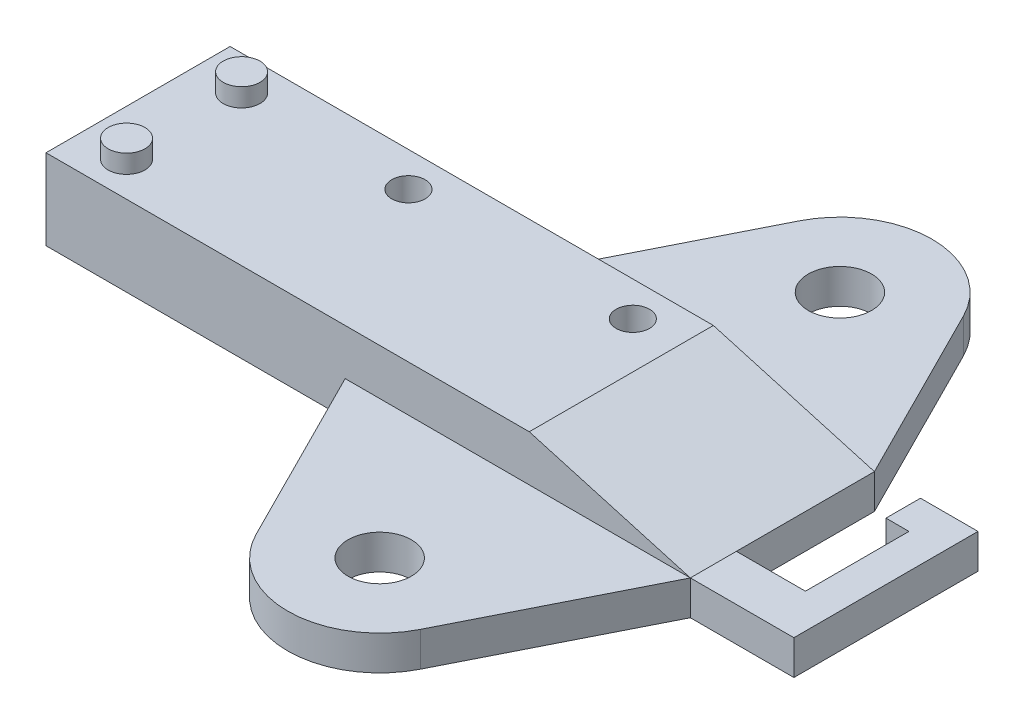
ISO-10303-21;
HEADER;
FILE_DESCRIPTION(('STEP AP214'),'2;1');
FILE_NAME('part.step','',(''),(''),'','','');
FILE_SCHEMA(('AUTOMOTIVE_DESIGN { 1 0 10303 214 1 1 1 1 }'));
ENDSEC;
DATA;
#1=APPLICATION_CONTEXT('core data for automotive mechanical design processes');
#2=APPLICATION_PROTOCOL_DEFINITION('international standard','automotive_design',2000,#1);
#3=PRODUCT_CONTEXT('',#1,'mechanical');
#4=PRODUCT('Part','Part','',(#3));
#5=PRODUCT_RELATED_PRODUCT_CATEGORY('part','',(#4));
#6=PRODUCT_DEFINITION_FORMATION('','',#4);
#7=PRODUCT_DEFINITION_CONTEXT('part definition',#1,'design');
#8=PRODUCT_DEFINITION('design','',#6,#7);
#9=PRODUCT_DEFINITION_SHAPE('','',#8);
#10=(LENGTH_UNIT() NAMED_UNIT(*) SI_UNIT(.MILLI.,.METRE.));
#11=(NAMED_UNIT(*) PLANE_ANGLE_UNIT() SI_UNIT($,.RADIAN.));
#12=(NAMED_UNIT(*) SI_UNIT($,.STERADIAN.) SOLID_ANGLE_UNIT());
#13=UNCERTAINTY_MEASURE_WITH_UNIT(LENGTH_MEASURE(1.E-05),#10,'distance_accuracy_value','');
#14=(GEOMETRIC_REPRESENTATION_CONTEXT(3) GLOBAL_UNCERTAINTY_ASSIGNED_CONTEXT((#13)) GLOBAL_UNIT_ASSIGNED_CONTEXT((#10,
#11,#12)) REPRESENTATION_CONTEXT('',''));
#15=CARTESIAN_POINT('',(0.,0.,0.));
#16=DIRECTION('',(0.,0.,1.));
#17=DIRECTION('',(1.,0.,0.));
#18=AXIS2_PLACEMENT_3D('',#15,#16,#17);
#19=CARTESIAN_POINT('',(-21.,7.,8.));
#20=DIRECTION('',(0.,0.,-1.));
#21=DIRECTION('',(-1.,0.,0.));
#22=AXIS2_PLACEMENT_3D('',#19,#20,#21);
#23=PLANE('',#22);
#24=DIRECTION('',(0.,-1.,0.));
#25=VECTOR('',#24,1.);
#26=CARTESIAN_POINT('',(5.00000000000001,3.,8.));
#27=LINE('',#26,#25);
#28=CARTESIAN_POINT('',(5.00000000000001,3.,8.));
#29=VERTEX_POINT('',#28);
#30=CARTESIAN_POINT('',(5.,0.,8.));
#31=VERTEX_POINT('',#30);
#32=EDGE_CURVE('E191',#29,#31,#27,.T.);
#33=ORIENTED_EDGE('',*,*,#32,.F.);
#34=DIRECTION('',(-1.,0.,0.));
#35=VECTOR('',#34,1.);
#36=CARTESIAN_POINT('',(5.00000000000001,3.,8.));
#37=LINE('',#36,#35);
#38=CARTESIAN_POINT('',(35.,3.,8.));
#39=VERTEX_POINT('',#38);
#40=EDGE_CURVE('E11',#39,#29,#37,.T.);
#41=ORIENTED_EDGE('',*,*,#40,.F.);
#42=DIRECTION('',(-0.961523947640823,0.274721127897378,0.));
#43=VECTOR('',#42,1.);
#44=CARTESIAN_POINT('',(21.,7.,8.));
#45=LINE('',#44,#43);
#46=CARTESIAN_POINT('',(21.,7.,8.));
#47=VERTEX_POINT('',#46);
#48=EDGE_CURVE('E189',#39,#47,#45,.T.);
#49=ORIENTED_EDGE('',*,*,#48,.T.);
#50=DIRECTION('',(1.,0.,0.));
#51=VECTOR('',#50,1.);
#52=CARTESIAN_POINT('',(-21.,7.,8.));
#53=LINE('',#52,#51);
#54=CARTESIAN_POINT('',(-21.,7.,8.));
#55=VERTEX_POINT('',#54);
#56=EDGE_CURVE('E328',#55,#47,#53,.T.);
#57=ORIENTED_EDGE('',*,*,#56,.F.);
#58=DIRECTION('',(0.,-1.,0.));
#59=VECTOR('',#58,1.);
#60=CARTESIAN_POINT('',(-21.,7.,8.));
#61=LINE('',#60,#59);
#62=CARTESIAN_POINT('',(-21.,0.,8.));
#63=VERTEX_POINT('',#62);
#64=EDGE_CURVE('E327',#55,#63,#61,.T.);
#65=ORIENTED_EDGE('',*,*,#64,.T.);
#66=DIRECTION('',(1.,0.,0.));
#67=VECTOR('',#66,1.);
#68=CARTESIAN_POINT('',(-21.,0.,8.));
#69=LINE('',#68,#67);
#70=EDGE_CURVE('E58',#63,#31,#69,.T.);
#71=ORIENTED_EDGE('',*,*,#70,.T.);
#72=EDGE_LOOP('',(#33,#41,#49,#57,#65,#71));
#73=FACE_BOUND('',#72,.T.);
#74=ADVANCED_FACE('F33',(#73),#23,.F.);
#75=CARTESIAN_POINT('',(-21.,7.,-8.));
#76=DIRECTION('',(0.,0.,1.));
#77=DIRECTION('',(1.,0.,0.));
#78=AXIS2_PLACEMENT_3D('',#75,#76,#77);
#79=PLANE('',#78);
#80=DIRECTION('',(1.,0.,0.));
#81=VECTOR('',#80,1.);
#82=CARTESIAN_POINT('',(5.00000000000001,3.,-8.));
#83=LINE('',#82,#81);
#84=CARTESIAN_POINT('',(5.00000000000001,3.,-8.));
#85=VERTEX_POINT('',#84);
#86=CARTESIAN_POINT('',(35.,3.,-8.));
#87=VERTEX_POINT('',#86);
#88=EDGE_CURVE('E362',#85,#87,#83,.T.);
#89=ORIENTED_EDGE('',*,*,#88,.F.);
#90=DIRECTION('',(0.,-1.,0.));
#91=VECTOR('',#90,1.);
#92=CARTESIAN_POINT('',(5.00000000000001,3.,-8.));
#93=LINE('',#92,#91);
#94=CARTESIAN_POINT('',(5.,0.,-8.));
#95=VERTEX_POINT('',#94);
#96=EDGE_CURVE('E297',#85,#95,#93,.T.);
#97=ORIENTED_EDGE('',*,*,#96,.T.);
#98=DIRECTION('',(-1.,0.,0.));
#99=VECTOR('',#98,1.);
#100=CARTESIAN_POINT('',(-21.,0.,-8.));
#101=LINE('',#100,#99);
#102=CARTESIAN_POINT('',(-21.,0.,-8.));
#103=VERTEX_POINT('',#102);
#104=EDGE_CURVE('E311',#95,#103,#101,.T.);
#105=ORIENTED_EDGE('',*,*,#104,.T.);
#106=DIRECTION('',(0.,-1.,0.));
#107=VECTOR('',#106,1.);
#108=CARTESIAN_POINT('',(-21.,7.,-8.));
#109=LINE('',#108,#107);
#110=CARTESIAN_POINT('',(-21.,7.,-8.));
#111=VERTEX_POINT('',#110);
#112=EDGE_CURVE('E42',#111,#103,#109,.T.);
#113=ORIENTED_EDGE('',*,*,#112,.F.);
#114=DIRECTION('',(-1.,0.,0.));
#115=VECTOR('',#114,1.);
#116=CARTESIAN_POINT('',(-21.,7.,-8.));
#117=LINE('',#116,#115);
#118=CARTESIAN_POINT('',(21.,7.,-8.));
#119=VERTEX_POINT('',#118);
#120=EDGE_CURVE('E354',#119,#111,#117,.T.);
#121=ORIENTED_EDGE('',*,*,#120,.F.);
#122=DIRECTION('',(-0.961523947640823,0.274721127897378,0.));
#123=VECTOR('',#122,1.);
#124=CARTESIAN_POINT('',(21.,7.,-8.));
#125=LINE('',#124,#123);
#126=EDGE_CURVE('E213',#87,#119,#125,.T.);
#127=ORIENTED_EDGE('',*,*,#126,.F.);
#128=EDGE_LOOP('',(#89,#97,#105,#113,#121,#127));
#129=FACE_BOUND('',#128,.T.);
#130=ADVANCED_FACE('F35',(#129),#79,.F.);
#131=CARTESIAN_POINT('',(-21.,7.,-8.));
#132=DIRECTION('',(1.,0.,0.));
#133=DIRECTION('',(0.,0.,-1.));
#134=AXIS2_PLACEMENT_3D('',#131,#132,#133);
#135=PLANE('',#134);
#136=DIRECTION('',(0.,0.,1.));
#137=VECTOR('',#136,1.);
#138=CARTESIAN_POINT('',(-21.,0.,-8.));
#139=LINE('',#138,#137);
#140=EDGE_CURVE('E321',#103,#63,#139,.T.);
#141=ORIENTED_EDGE('',*,*,#140,.T.);
#142=ORIENTED_EDGE('',*,*,#64,.F.);
#143=DIRECTION('',(0.,0.,1.));
#144=VECTOR('',#143,1.);
#145=CARTESIAN_POINT('',(-21.,7.,-8.));
#146=LINE('',#145,#144);
#147=EDGE_CURVE('E336',#111,#55,#146,.T.);
#148=ORIENTED_EDGE('',*,*,#147,.F.);
#149=ORIENTED_EDGE('',*,*,#112,.T.);
#150=EDGE_LOOP('',(#141,#142,#148,#149));
#151=FACE_BOUND('',#150,.T.);
#152=ADVANCED_FACE('F334',(#151),#135,.F.);
#153=CARTESIAN_POINT('',(0.,7.,0.));
#154=DIRECTION('',(0.,1.,0.));
#155=DIRECTION('',(0.,0.,1.));
#156=AXIS2_PLACEMENT_3D('',#153,#154,#155);
#157=PLANE('',#156);
#158=CARTESIAN_POINT('',(17.,7.,-5.));
#159=DIRECTION('',(0.,1.,0.));
#160=DIRECTION('',(0.,0.,1.));
#161=AXIS2_PLACEMENT_3D('',#158,#159,#160);
#162=CIRCLE('',#161,1.45);
#163=CARTESIAN_POINT('',(17.,7.,-3.55));
#164=VERTEX_POINT('',#163);
#165=EDGE_CURVE('E715',#164,#164,#162,.T.);
#166=ORIENTED_EDGE('',*,*,#165,.F.);
#167=EDGE_LOOP('',(#166));
#168=FACE_BOUND('',#167,.T.);
#169=CARTESIAN_POINT('',(-2.5,7.,-5.));
#170=DIRECTION('',(0.,1.,0.));
#171=DIRECTION('',(0.,0.,1.));
#172=AXIS2_PLACEMENT_3D('',#169,#170,#171);
#173=CIRCLE('',#172,1.45);
#174=CARTESIAN_POINT('',(-2.5,7.,-3.55));
#175=VERTEX_POINT('',#174);
#176=EDGE_CURVE('E723',#175,#175,#173,.T.);
#177=ORIENTED_EDGE('',*,*,#176,.F.);
#178=EDGE_LOOP('',(#177));
#179=FACE_BOUND('',#178,.T.);
#180=CARTESIAN_POINT('',(-17.,7.,5.));
#181=DIRECTION('',(0.,1.,0.));
#182=DIRECTION('',(0.,0.,1.));
#183=AXIS2_PLACEMENT_3D('',#180,#181,#182);
#184=CIRCLE('',#183,1.6);
#185=CARTESIAN_POINT('',(-17.,7.,6.6));
#186=VERTEX_POINT('',#185);
#187=EDGE_CURVE('E350',#186,#186,#184,.T.);
#188=ORIENTED_EDGE('',*,*,#187,.F.);
#189=EDGE_LOOP('',(#188));
#190=FACE_BOUND('',#189,.T.);
#191=CARTESIAN_POINT('',(-17.,7.,-5.));
#192=DIRECTION('',(0.,1.,0.));
#193=DIRECTION('',(0.,0.,1.));
#194=AXIS2_PLACEMENT_3D('',#191,#192,#193);
#195=CIRCLE('',#194,1.6);
#196=CARTESIAN_POINT('',(-17.,7.,-3.4));
#197=VERTEX_POINT('',#196);
#198=EDGE_CURVE('E342',#197,#197,#195,.T.);
#199=ORIENTED_EDGE('',*,*,#198,.F.);
#200=EDGE_LOOP('',(#199));
#201=FACE_BOUND('',#200,.T.);
#202=DIRECTION('',(0.,0.,-1.));
#203=VECTOR('',#202,1.);
#204=CARTESIAN_POINT('',(21.,7.,-8.));
#205=LINE('',#204,#203);
#206=EDGE_CURVE('E212',#47,#119,#205,.T.);
#207=ORIENTED_EDGE('',*,*,#206,.T.);
#208=ORIENTED_EDGE('',*,*,#120,.T.);
#209=ORIENTED_EDGE('',*,*,#147,.T.);
#210=ORIENTED_EDGE('',*,*,#56,.T.);
#211=EDGE_LOOP('',(#207,#208,#209,#210));
#212=FACE_BOUND('',#211,.T.);
#213=ADVANCED_FACE('F359',(#168,#179,#190,#201,#212),#157,.T.);
#214=CARTESIAN_POINT('',(0.,0.,0.));
#215=DIRECTION('',(0.,1.,0.));
#216=DIRECTION('',(0.,0.,1.));
#217=AXIS2_PLACEMENT_3D('',#214,#215,#216);
#218=PLANE('',#217);
#219=DIRECTION('',(-0.449766227502967,0.,-0.893146315335707));
#220=VECTOR('',#219,1.);
#221=CARTESIAN_POINT('',(35.,0.,-8.));
#222=LINE('',#221,#220);
#223=CARTESIAN_POINT('',(35.,0.,-8.));
#224=VERTEX_POINT('',#223);
#225=CARTESIAN_POINT('',(27.1451705226857,0.,-23.5981298200237));
#226=VERTEX_POINT('',#225);
#227=EDGE_CURVE('E283',#224,#226,#222,.T.);
#228=ORIENTED_EDGE('',*,*,#227,.F.);
#229=DIRECTION('',(0.,0.,-1.));
#230=VECTOR('',#229,1.);
#231=CARTESIAN_POINT('',(35.,0.,8.));
#232=LINE('',#231,#230);
#233=CARTESIAN_POINT('',(35.,0.,4.));
#234=VERTEX_POINT('',#233);
#235=EDGE_CURVE('E183',#234,#224,#232,.T.);
#236=ORIENTED_EDGE('',*,*,#235,.F.);
#237=DIRECTION('',(-1.,0.,0.));
#238=VECTOR('',#237,1.);
#239=CARTESIAN_POINT('',(41.,0.,4.));
#240=LINE('',#239,#238);
#241=CARTESIAN_POINT('',(41.,0.,4.));
#242=VERTEX_POINT('',#241);
#243=EDGE_CURVE('E50',#242,#234,#240,.T.);
#244=ORIENTED_EDGE('',*,*,#243,.F.);
#245=DIRECTION('',(0.,0.,1.));
#246=VECTOR('',#245,1.);
#247=CARTESIAN_POINT('',(41.,0.,-5.));
#248=LINE('',#247,#246);
#249=CARTESIAN_POINT('',(41.,0.,-5.));
#250=VERTEX_POINT('',#249);
#251=EDGE_CURVE('E237',#250,#242,#248,.T.);
#252=ORIENTED_EDGE('',*,*,#251,.F.);
#253=DIRECTION('',(1.,0.,0.));
#254=VECTOR('',#253,1.);
#255=CARTESIAN_POINT('',(39.,0.,-5.));
#256=LINE('',#255,#254);
#257=CARTESIAN_POINT('',(39.,0.,-5.));
#258=VERTEX_POINT('',#257);
#259=EDGE_CURVE('E271',#258,#250,#256,.T.);
#260=ORIENTED_EDGE('',*,*,#259,.F.);
#261=DIRECTION('',(0.,0.,1.));
#262=VECTOR('',#261,1.);
#263=CARTESIAN_POINT('',(39.,0.,-8.));
#264=LINE('',#263,#262);
#265=CARTESIAN_POINT('',(39.,0.,-8.));
#266=VERTEX_POINT('',#265);
#267=EDGE_CURVE('E266',#266,#258,#264,.T.);
#268=ORIENTED_EDGE('',*,*,#267,.F.);
#269=DIRECTION('',(-1.,0.,0.));
#270=VECTOR('',#269,1.);
#271=CARTESIAN_POINT('',(44.,0.,-8.));
#272=LINE('',#271,#270);
#273=CARTESIAN_POINT('',(44.,0.,-8.));
#274=VERTEX_POINT('',#273);
#275=EDGE_CURVE('E264',#274,#266,#272,.T.);
#276=ORIENTED_EDGE('',*,*,#275,.F.);
#277=DIRECTION('',(0.,0.,-1.));
#278=VECTOR('',#277,1.);
#279=CARTESIAN_POINT('',(44.,0.,8.));
#280=LINE('',#279,#278);
#281=CARTESIAN_POINT('',(44.,0.,8.));
#282=VERTEX_POINT('',#281);
#283=EDGE_CURVE('E257',#282,#274,#280,.T.);
#284=ORIENTED_EDGE('',*,*,#283,.F.);
#285=DIRECTION('',(1.,0.,0.));
#286=VECTOR('',#285,1.);
#287=CARTESIAN_POINT('',(35.,0.,8.));
#288=LINE('',#287,#286);
#289=CARTESIAN_POINT('',(35.,0.,8.));
#290=VERTEX_POINT('',#289);
#291=EDGE_CURVE('E262',#290,#282,#288,.T.);
#292=ORIENTED_EDGE('',*,*,#291,.F.);
#293=DIRECTION('',(0.449766227502967,0.,-0.893146315335707));
#294=VECTOR('',#293,1.);
#295=CARTESIAN_POINT('',(35.,0.,8.));
#296=LINE('',#295,#294);
#297=CARTESIAN_POINT('',(27.1451705226857,0.,23.5981298200237));
#298=VERTEX_POINT('',#297);
#299=EDGE_CURVE('E206',#298,#290,#296,.T.);
#300=ORIENTED_EDGE('',*,*,#299,.F.);
#301=CARTESIAN_POINT('',(20.,0.,20.));
#302=DIRECTION('',(0.,1.,0.));
#303=DIRECTION('',(0.,0.,-1.));
#304=AXIS2_PLACEMENT_3D('',#301,#302,#303);
#305=CIRCLE('',#304,8.);
#306=CARTESIAN_POINT('',(12.8548294773144,0.,23.5981298200237));
#307=VERTEX_POINT('',#306);
#308=EDGE_CURVE('E392',#307,#298,#305,.T.);
#309=ORIENTED_EDGE('',*,*,#308,.F.);
#310=DIRECTION('',(0.449766227502967,0.,0.893146315335707));
#311=VECTOR('',#310,1.);
#312=CARTESIAN_POINT('',(12.8548294773144,0.,23.5981298200237));
#313=LINE('',#312,#311);
#314=EDGE_CURVE('E391',#31,#307,#313,.T.);
#315=ORIENTED_EDGE('',*,*,#314,.F.);
#316=ORIENTED_EDGE('',*,*,#70,.F.);
#317=ORIENTED_EDGE('',*,*,#140,.F.);
#318=ORIENTED_EDGE('',*,*,#104,.F.);
#319=DIRECTION('',(-0.449766227502967,0.,0.893146315335707));
#320=VECTOR('',#319,1.);
#321=CARTESIAN_POINT('',(12.8548294773144,0.,-23.5981298200237));
#322=LINE('',#321,#320);
#323=CARTESIAN_POINT('',(12.8548294773144,0.,-23.5981298200237));
#324=VERTEX_POINT('',#323);
#325=EDGE_CURVE('E314',#324,#95,#322,.T.);
#326=ORIENTED_EDGE('',*,*,#325,.F.);
#327=CARTESIAN_POINT('',(20.,0.,-20.));
#328=DIRECTION('',(0.,1.,0.));
#329=DIRECTION('',(0.,0.,1.));
#330=AXIS2_PLACEMENT_3D('',#327,#328,#329);
#331=CIRCLE('',#330,8.);
#332=EDGE_CURVE('E316',#226,#324,#331,.T.);
#333=ORIENTED_EDGE('',*,*,#332,.F.);
#334=EDGE_LOOP('',(#228,#236,#244,#252,#260,#268,#276,#284,#292,#300,#309,#315,#316,#317,#318,
#326,#333));
#335=FACE_BOUND('',#334,.T.);
#336=CARTESIAN_POINT('',(17.,0.,-5.));
#337=DIRECTION('',(0.,1.,0.));
#338=DIRECTION('',(0.,0.,1.));
#339=AXIS2_PLACEMENT_3D('',#336,#337,#338);
#340=CIRCLE('',#339,1.45);
#341=CARTESIAN_POINT('',(17.,0.,-3.55));
#342=VERTEX_POINT('',#341);
#343=EDGE_CURVE('E713',#342,#342,#340,.T.);
#344=ORIENTED_EDGE('',*,*,#343,.T.);
#345=EDGE_LOOP('',(#344));
#346=FACE_BOUND('',#345,.T.);
#347=CARTESIAN_POINT('',(-2.5,0.,-5.));
#348=DIRECTION('',(0.,1.,0.));
#349=DIRECTION('',(0.,0.,1.));
#350=AXIS2_PLACEMENT_3D('',#347,#348,#349);
#351=CIRCLE('',#350,1.45);
#352=CARTESIAN_POINT('',(-2.5,0.,-3.55));
#353=VERTEX_POINT('',#352);
#354=EDGE_CURVE('E718',#353,#353,#351,.T.);
#355=ORIENTED_EDGE('',*,*,#354,.T.);
#356=EDGE_LOOP('',(#355));
#357=FACE_BOUND('',#356,.T.);
#358=CARTESIAN_POINT('',(20.,0.,-20.));
#359=DIRECTION('',(0.,1.,0.));
#360=DIRECTION('',(0.,0.,1.));
#361=AXIS2_PLACEMENT_3D('',#358,#359,#360);
#362=CIRCLE('',#361,2.74999999999999);
#363=CARTESIAN_POINT('',(20.,0.,-17.25));
#364=VERTEX_POINT('',#363);
#365=EDGE_CURVE('E380',#364,#364,#362,.T.);
#366=ORIENTED_EDGE('',*,*,#365,.T.);
#367=EDGE_LOOP('',(#366));
#368=FACE_BOUND('',#367,.T.);
#369=CARTESIAN_POINT('',(20.,0.,20.));
#370=DIRECTION('',(0.,1.,0.));
#371=DIRECTION('',(0.,0.,-1.));
#372=AXIS2_PLACEMENT_3D('',#369,#370,#371);
#373=CIRCLE('',#372,2.74999999999999);
#374=CARTESIAN_POINT('',(20.,0.,17.25));
#375=VERTEX_POINT('',#374);
#376=EDGE_CURVE('E228',#375,#375,#373,.T.);
#377=ORIENTED_EDGE('',*,*,#376,.T.);
#378=EDGE_LOOP('',(#377));
#379=FACE_BOUND('',#378,.T.);
#380=ADVANCED_FACE('F260',(#335,#346,#357,#368,#379),#218,.F.);
#381=CARTESIAN_POINT('',(-17.,8.6,-5.));
#382=DIRECTION('',(0.,-1.,0.));
#383=DIRECTION('',(0.,0.,-1.));
#384=AXIS2_PLACEMENT_3D('',#381,#382,#383);
#385=CYLINDRICAL_SURFACE('',#384,1.6);
#386=CARTESIAN_POINT('',(-17.,8.6,-5.));
#387=DIRECTION('',(0.,1.,0.));
#388=DIRECTION('',(0.,0.,1.));
#389=AXIS2_PLACEMENT_3D('',#386,#387,#388);
#390=CIRCLE('',#389,1.6);
#391=CARTESIAN_POINT('',(-17.,8.6,-3.4));
#392=VERTEX_POINT('',#391);
#393=EDGE_CURVE('E340',#392,#392,#390,.T.);
#394=ORIENTED_EDGE('',*,*,#393,.F.);
#395=EDGE_LOOP('',(#394));
#396=FACE_BOUND('',#395,.T.);
#397=ORIENTED_EDGE('',*,*,#198,.T.);
#398=EDGE_LOOP('',(#397));
#399=FACE_BOUND('',#398,.T.);
#400=ADVANCED_FACE('F433',(#396,#399),#385,.T.);
#401=CARTESIAN_POINT('',(-17.,8.6,-5.));
#402=DIRECTION('',(0.,1.,0.));
#403=DIRECTION('',(0.,0.,1.));
#404=AXIS2_PLACEMENT_3D('',#401,#402,#403);
#405=PLANE('',#404);
#406=ORIENTED_EDGE('',*,*,#393,.T.);
#407=EDGE_LOOP('',(#406));
#408=FACE_BOUND('',#407,.T.);
#409=ADVANCED_FACE('F439',(#408),#405,.T.);
#410=CARTESIAN_POINT('',(-17.,8.6,5.));
#411=DIRECTION('',(0.,-1.,0.));
#412=DIRECTION('',(0.,0.,-1.));
#413=AXIS2_PLACEMENT_3D('',#410,#411,#412);
#414=CYLINDRICAL_SURFACE('',#413,1.6);
#415=CARTESIAN_POINT('',(-17.,8.6,5.));
#416=DIRECTION('',(0.,1.,0.));
#417=DIRECTION('',(0.,0.,1.));
#418=AXIS2_PLACEMENT_3D('',#415,#416,#417);
#419=CIRCLE('',#418,1.6);
#420=CARTESIAN_POINT('',(-17.,8.6,6.6));
#421=VERTEX_POINT('',#420);
#422=EDGE_CURVE('E347',#421,#421,#419,.T.);
#423=ORIENTED_EDGE('',*,*,#422,.F.);
#424=EDGE_LOOP('',(#423));
#425=FACE_BOUND('',#424,.T.);
#426=ORIENTED_EDGE('',*,*,#187,.T.);
#427=EDGE_LOOP('',(#426));
#428=FACE_BOUND('',#427,.T.);
#429=ADVANCED_FACE('F443',(#425,#428),#414,.T.);
#430=CARTESIAN_POINT('',(-17.,8.6,5.));
#431=DIRECTION('',(0.,1.,0.));
#432=DIRECTION('',(0.,0.,1.));
#433=AXIS2_PLACEMENT_3D('',#430,#431,#432);
#434=PLANE('',#433);
#435=ORIENTED_EDGE('',*,*,#422,.T.);
#436=EDGE_LOOP('',(#435));
#437=FACE_BOUND('',#436,.T.);
#438=ADVANCED_FACE('F446',(#437),#434,.T.);
#439=CARTESIAN_POINT('',(-2.5,8.601,-5.));
#440=DIRECTION('',(0.,-1.,0.));
#441=DIRECTION('',(0.,0.,-1.));
#442=AXIS2_PLACEMENT_3D('',#439,#440,#441);
#443=CYLINDRICAL_SURFACE('',#442,1.45);
#444=ORIENTED_EDGE('',*,*,#176,.T.);
#445=EDGE_LOOP('',(#444));
#446=FACE_BOUND('',#445,.T.);
#447=ORIENTED_EDGE('',*,*,#354,.F.);
#448=EDGE_LOOP('',(#447));
#449=FACE_BOUND('',#448,.T.);
#450=ADVANCED_FACE('F450',(#446,#449),#443,.F.);
#451=CARTESIAN_POINT('',(17.,8.601,-5.));
#452=DIRECTION('',(0.,-1.,0.));
#453=DIRECTION('',(0.,0.,-1.));
#454=AXIS2_PLACEMENT_3D('',#451,#452,#453);
#455=CYLINDRICAL_SURFACE('',#454,1.45);
#456=ORIENTED_EDGE('',*,*,#165,.T.);
#457=EDGE_LOOP('',(#456));
#458=FACE_BOUND('',#457,.T.);
#459=ORIENTED_EDGE('',*,*,#343,.F.);
#460=EDGE_LOOP('',(#459));
#461=FACE_BOUND('',#460,.T.);
#462=ADVANCED_FACE('F454',(#458,#461),#455,.F.);
#463=CARTESIAN_POINT('',(20.,3.,-20.));
#464=DIRECTION('',(0.,1.,0.));
#465=DIRECTION('',(0.,0.,1.));
#466=AXIS2_PLACEMENT_3D('',#463,#464,#465);
#467=PLANE('',#466);
#468=CARTESIAN_POINT('',(20.,3.,-20.));
#469=DIRECTION('',(0.,1.,0.));
#470=DIRECTION('',(0.,0.,1.));
#471=AXIS2_PLACEMENT_3D('',#468,#469,#470);
#472=CIRCLE('',#471,8.);
#473=CARTESIAN_POINT('',(27.1451705226857,3.,-23.5981298200237));
#474=VERTEX_POINT('',#473);
#475=CARTESIAN_POINT('',(12.8548294773144,3.,-23.5981298200237));
#476=VERTEX_POINT('',#475);
#477=EDGE_CURVE('E371',#474,#476,#472,.T.);
#478=ORIENTED_EDGE('',*,*,#477,.T.);
#479=DIRECTION('',(-0.449766227502967,0.,0.893146315335707));
#480=VECTOR('',#479,1.);
#481=CARTESIAN_POINT('',(12.8548294773144,3.,-23.5981298200237));
#482=LINE('',#481,#480);
#483=EDGE_CURVE('E367',#476,#85,#482,.T.);
#484=ORIENTED_EDGE('',*,*,#483,.T.);
#485=ORIENTED_EDGE('',*,*,#88,.T.);
#486=DIRECTION('',(-0.449766227502967,0.,-0.893146315335707));
#487=VECTOR('',#486,1.);
#488=CARTESIAN_POINT('',(35.,3.,-8.));
#489=LINE('',#488,#487);
#490=EDGE_CURVE('E296',#87,#474,#489,.T.);
#491=ORIENTED_EDGE('',*,*,#490,.T.);
#492=EDGE_LOOP('',(#478,#484,#485,#491));
#493=FACE_BOUND('',#492,.T.);
#494=CARTESIAN_POINT('',(20.,3.,-20.));
#495=DIRECTION('',(0.,1.,0.));
#496=DIRECTION('',(0.,0.,1.));
#497=AXIS2_PLACEMENT_3D('',#494,#495,#496);
#498=CIRCLE('',#497,2.74999999999999);
#499=CARTESIAN_POINT('',(20.,3.,-17.25));
#500=VERTEX_POINT('',#499);
#501=EDGE_CURVE('E376',#500,#500,#498,.T.);
#502=ORIENTED_EDGE('',*,*,#501,.F.);
#503=EDGE_LOOP('',(#502));
#504=FACE_BOUND('',#503,.T.);
#505=ADVANCED_FACE('F365',(#493,#504),#467,.T.);
#506=CARTESIAN_POINT('',(20.,3.,-20.));
#507=DIRECTION('',(0.,-1.,0.));
#508=DIRECTION('',(0.,0.,-1.));
#509=AXIS2_PLACEMENT_3D('',#506,#507,#508);
#510=CYLINDRICAL_SURFACE('',#509,8.);
#511=ORIENTED_EDGE('',*,*,#332,.T.);
#512=DIRECTION('',(0.,-1.,0.));
#513=VECTOR('',#512,1.);
#514=CARTESIAN_POINT('',(12.8548294773144,3.,-23.5981298200237));
#515=LINE('',#514,#513);
#516=EDGE_CURVE('E301',#476,#324,#515,.T.);
#517=ORIENTED_EDGE('',*,*,#516,.F.);
#518=ORIENTED_EDGE('',*,*,#477,.F.);
#519=DIRECTION('',(0.,-1.,0.));
#520=VECTOR('',#519,1.);
#521=CARTESIAN_POINT('',(27.1451705226857,3.,-23.5981298200237));
#522=LINE('',#521,#520);
#523=EDGE_CURVE('E298',#474,#226,#522,.T.);
#524=ORIENTED_EDGE('',*,*,#523,.T.);
#525=EDGE_LOOP('',(#511,#517,#518,#524));
#526=FACE_BOUND('',#525,.T.);
#527=ADVANCED_FACE('F459',(#526),#510,.T.);
#528=CARTESIAN_POINT('',(12.8548294773144,3.,-23.5981298200237));
#529=DIRECTION('',(0.893146315335707,0.,0.449766227502967));
#530=DIRECTION('',(0.449766227502967,0.,-0.893146315335707));
#531=AXIS2_PLACEMENT_3D('',#528,#529,#530);
#532=PLANE('',#531);
#533=ORIENTED_EDGE('',*,*,#325,.T.);
#534=ORIENTED_EDGE('',*,*,#96,.F.);
#535=ORIENTED_EDGE('',*,*,#483,.F.);
#536=ORIENTED_EDGE('',*,*,#516,.T.);
#537=EDGE_LOOP('',(#533,#534,#535,#536));
#538=FACE_BOUND('',#537,.T.);
#539=ADVANCED_FACE('F462',(#538),#532,.F.);
#540=CARTESIAN_POINT('',(35.,3.,-8.));
#541=DIRECTION('',(-0.893146315335707,0.,0.449766227502967));
#542=DIRECTION('',(0.449766227502967,0.,0.893146315335707));
#543=AXIS2_PLACEMENT_3D('',#540,#541,#542);
#544=PLANE('',#543);
#545=ORIENTED_EDGE('',*,*,#227,.T.);
#546=ORIENTED_EDGE('',*,*,#523,.F.);
#547=ORIENTED_EDGE('',*,*,#490,.F.);
#548=DIRECTION('',(0.,-1.,0.));
#549=VECTOR('',#548,1.);
#550=CARTESIAN_POINT('',(35.,3.,-8.));
#551=LINE('',#550,#549);
#552=EDGE_CURVE('E289',#87,#224,#551,.T.);
#553=ORIENTED_EDGE('',*,*,#552,.T.);
#554=EDGE_LOOP('',(#545,#546,#547,#553));
#555=FACE_BOUND('',#554,.T.);
#556=ADVANCED_FACE('F293',(#555),#544,.F.);
#557=CARTESIAN_POINT('',(20.,3.,-20.));
#558=DIRECTION('',(0.,-1.,0.));
#559=DIRECTION('',(0.,0.,-1.));
#560=AXIS2_PLACEMENT_3D('',#557,#558,#559);
#561=CYLINDRICAL_SURFACE('',#560,2.74999999999999);
#562=ORIENTED_EDGE('',*,*,#501,.T.);
#563=EDGE_LOOP('',(#562));
#564=FACE_BOUND('',#563,.T.);
#565=ORIENTED_EDGE('',*,*,#365,.F.);
#566=EDGE_LOOP('',(#565));
#567=FACE_BOUND('',#566,.T.);
#568=ADVANCED_FACE('F406',(#564,#567),#561,.F.);
#569=CARTESIAN_POINT('',(20.,3.,20.));
#570=DIRECTION('',(0.,-1.,0.));
#571=DIRECTION('',(0.,0.,-1.));
#572=AXIS2_PLACEMENT_3D('',#569,#570,#571);
#573=PLANE('',#572);
#574=CARTESIAN_POINT('',(20.,3.,20.));
#575=DIRECTION('',(0.,1.,0.));
#576=DIRECTION('',(0.,0.,-1.));
#577=AXIS2_PLACEMENT_3D('',#574,#575,#576);
#578=CIRCLE('',#577,8.);
#579=CARTESIAN_POINT('',(12.8548294773144,3.,23.5981298200237));
#580=VERTEX_POINT('',#579);
#581=CARTESIAN_POINT('',(27.1451705226857,3.,23.5981298200237));
#582=VERTEX_POINT('',#581);
#583=EDGE_CURVE('E199',#580,#582,#578,.T.);
#584=ORIENTED_EDGE('',*,*,#583,.T.);
#585=DIRECTION('',(0.449766227502967,0.,-0.893146315335707));
#586=VECTOR('',#585,1.);
#587=CARTESIAN_POINT('',(35.,3.,8.));
#588=LINE('',#587,#586);
#589=EDGE_CURVE('E195',#582,#39,#588,.T.);
#590=ORIENTED_EDGE('',*,*,#589,.T.);
#591=ORIENTED_EDGE('',*,*,#40,.T.);
#592=DIRECTION('',(0.449766227502967,0.,0.893146315335707));
#593=VECTOR('',#592,1.);
#594=CARTESIAN_POINT('',(12.8548294773144,3.,23.5981298200237));
#595=LINE('',#594,#593);
#596=EDGE_CURVE('E203',#29,#580,#595,.T.);
#597=ORIENTED_EDGE('',*,*,#596,.T.);
#598=EDGE_LOOP('',(#584,#590,#591,#597));
#599=FACE_BOUND('',#598,.T.);
#600=CARTESIAN_POINT('',(20.,3.,20.));
#601=DIRECTION('',(0.,1.,0.));
#602=DIRECTION('',(0.,0.,-1.));
#603=AXIS2_PLACEMENT_3D('',#600,#601,#602);
#604=CIRCLE('',#603,2.74999999999999);
#605=CARTESIAN_POINT('',(20.,3.,17.25));
#606=VERTEX_POINT('',#605);
#607=EDGE_CURVE('E395',#606,#606,#604,.T.);
#608=ORIENTED_EDGE('',*,*,#607,.F.);
#609=EDGE_LOOP('',(#608));
#610=FACE_BOUND('',#609,.T.);
#611=ADVANCED_FACE('F196',(#599,#610),#573,.F.);
#612=CARTESIAN_POINT('',(20.,3.,20.));
#613=DIRECTION('',(0.,-1.,0.));
#614=DIRECTION('',(0.,0.,-1.));
#615=AXIS2_PLACEMENT_3D('',#612,#613,#614);
#616=CYLINDRICAL_SURFACE('',#615,8.);
#617=ORIENTED_EDGE('',*,*,#308,.T.);
#618=DIRECTION('',(0.,-1.,0.));
#619=VECTOR('',#618,1.);
#620=CARTESIAN_POINT('',(27.1451705226857,3.,23.5981298200237));
#621=LINE('',#620,#619);
#622=EDGE_CURVE('E207',#582,#298,#621,.T.);
#623=ORIENTED_EDGE('',*,*,#622,.F.);
#624=ORIENTED_EDGE('',*,*,#583,.F.);
#625=DIRECTION('',(0.,-1.,0.));
#626=VECTOR('',#625,1.);
#627=CARTESIAN_POINT('',(12.8548294773144,3.,23.5981298200237));
#628=LINE('',#627,#626);
#629=EDGE_CURVE('E387',#580,#307,#628,.T.);
#630=ORIENTED_EDGE('',*,*,#629,.T.);
#631=EDGE_LOOP('',(#617,#623,#624,#630));
#632=FACE_BOUND('',#631,.T.);
#633=ADVANCED_FACE('F405',(#632),#616,.T.);
#634=CARTESIAN_POINT('',(35.,3.,8.));
#635=DIRECTION('',(-0.893146315335707,0.,-0.449766227502967));
#636=DIRECTION('',(-0.449766227502967,0.,0.893146315335707));
#637=AXIS2_PLACEMENT_3D('',#634,#635,#636);
#638=PLANE('',#637);
#639=ORIENTED_EDGE('',*,*,#299,.T.);
#640=DIRECTION('',(0.,-1.,0.));
#641=VECTOR('',#640,1.);
#642=CARTESIAN_POINT('',(35.,3.,8.));
#643=LINE('',#642,#641);
#644=EDGE_CURVE('E167',#39,#290,#643,.T.);
#645=ORIENTED_EDGE('',*,*,#644,.F.);
#646=ORIENTED_EDGE('',*,*,#589,.F.);
#647=ORIENTED_EDGE('',*,*,#622,.T.);
#648=EDGE_LOOP('',(#639,#645,#646,#647));
#649=FACE_BOUND('',#648,.T.);
#650=ADVANCED_FACE('F205',(#649),#638,.F.);
#651=CARTESIAN_POINT('',(12.8548294773144,3.,23.5981298200237));
#652=DIRECTION('',(0.893146315335707,0.,-0.449766227502967));
#653=DIRECTION('',(-0.449766227502967,0.,-0.893146315335707));
#654=AXIS2_PLACEMENT_3D('',#651,#652,#653);
#655=PLANE('',#654);
#656=ORIENTED_EDGE('',*,*,#314,.T.);
#657=ORIENTED_EDGE('',*,*,#629,.F.);
#658=ORIENTED_EDGE('',*,*,#596,.F.);
#659=ORIENTED_EDGE('',*,*,#32,.T.);
#660=EDGE_LOOP('',(#656,#657,#658,#659));
#661=FACE_BOUND('',#660,.T.);
#662=ADVANCED_FACE('F472',(#661),#655,.F.);
#663=CARTESIAN_POINT('',(20.,3.,20.));
#664=DIRECTION('',(0.,-1.,0.));
#665=DIRECTION('',(0.,0.,-1.));
#666=AXIS2_PLACEMENT_3D('',#663,#664,#665);
#667=CYLINDRICAL_SURFACE('',#666,2.74999999999999);
#668=ORIENTED_EDGE('',*,*,#607,.T.);
#669=EDGE_LOOP('',(#668));
#670=FACE_BOUND('',#669,.T.);
#671=ORIENTED_EDGE('',*,*,#376,.F.);
#672=EDGE_LOOP('',(#671));
#673=FACE_BOUND('',#672,.T.);
#674=ADVANCED_FACE('F402',(#670,#673),#667,.F.);
#675=CARTESIAN_POINT('',(35.,3.,8.));
#676=DIRECTION('',(-1.,0.,0.));
#677=DIRECTION('',(0.,0.,1.));
#678=AXIS2_PLACEMENT_3D('',#675,#676,#677);
#679=PLANE('',#678);
#680=DIRECTION('',(0.,0.,-1.));
#681=VECTOR('',#680,1.);
#682=CARTESIAN_POINT('',(35.,3.,8.));
#683=LINE('',#682,#681);
#684=CARTESIAN_POINT('',(35.,3.,4.));
#685=VERTEX_POINT('',#684);
#686=EDGE_CURVE('E184',#685,#87,#683,.T.);
#687=ORIENTED_EDGE('',*,*,#686,.F.);
#688=DIRECTION('',(0.,-1.,0.));
#689=VECTOR('',#688,1.);
#690=CARTESIAN_POINT('',(35.,3.,4.));
#691=LINE('',#690,#689);
#692=EDGE_CURVE('E229',#685,#234,#691,.T.);
#693=ORIENTED_EDGE('',*,*,#692,.T.);
#694=ORIENTED_EDGE('',*,*,#235,.T.);
#695=ORIENTED_EDGE('',*,*,#552,.F.);
#696=EDGE_LOOP('',(#687,#693,#694,#695));
#697=FACE_BOUND('',#696,.T.);
#698=ADVANCED_FACE('F288',(#697),#679,.F.);
#699=CARTESIAN_POINT('',(21.,7.,8.));
#700=DIRECTION('',(-0.274721127897378,-0.961523947640823,0.));
#701=DIRECTION('',(0.961523947640823,-0.274721127897378,0.));
#702=AXIS2_PLACEMENT_3D('',#699,#700,#701);
#703=PLANE('',#702);
#704=ORIENTED_EDGE('',*,*,#126,.T.);
#705=ORIENTED_EDGE('',*,*,#206,.F.);
#706=ORIENTED_EDGE('',*,*,#48,.F.);
#707=EDGE_CURVE('E176',#39,#685,#683,.T.);
#708=ORIENTED_EDGE('',*,*,#707,.T.);
#709=ORIENTED_EDGE('',*,*,#686,.T.);
#710=EDGE_LOOP('',(#704,#705,#706,#708,#709));
#711=FACE_BOUND('',#710,.T.);
#712=ADVANCED_FACE('F210',(#711),#703,.F.);
#713=CARTESIAN_POINT('',(35.,3.,8.));
#714=DIRECTION('',(0.,0.,-1.));
#715=DIRECTION('',(-1.,0.,0.));
#716=AXIS2_PLACEMENT_3D('',#713,#714,#715);
#717=PLANE('',#716);
#718=ORIENTED_EDGE('',*,*,#291,.T.);
#719=DIRECTION('',(0.,-1.,0.));
#720=VECTOR('',#719,1.);
#721=CARTESIAN_POINT('',(44.,3.,8.));
#722=LINE('',#721,#720);
#723=CARTESIAN_POINT('',(44.,3.,8.));
#724=VERTEX_POINT('',#723);
#725=EDGE_CURVE('E170',#724,#282,#722,.T.);
#726=ORIENTED_EDGE('',*,*,#725,.F.);
#727=DIRECTION('',(1.,0.,0.));
#728=VECTOR('',#727,1.);
#729=CARTESIAN_POINT('',(35.,3.,8.));
#730=LINE('',#729,#728);
#731=EDGE_CURVE('E163',#39,#724,#730,.T.);
#732=ORIENTED_EDGE('',*,*,#731,.F.);
#733=ORIENTED_EDGE('',*,*,#644,.T.);
#734=EDGE_LOOP('',(#718,#726,#732,#733));
#735=FACE_BOUND('',#734,.T.);
#736=ADVANCED_FACE('F165',(#735),#717,.F.);
#737=CARTESIAN_POINT('',(44.,3.,8.));
#738=DIRECTION('',(-1.,0.,0.));
#739=DIRECTION('',(0.,0.,1.));
#740=AXIS2_PLACEMENT_3D('',#737,#738,#739);
#741=PLANE('',#740);
#742=ORIENTED_EDGE('',*,*,#283,.T.);
#743=DIRECTION('',(0.,-1.,0.));
#744=VECTOR('',#743,1.);
#745=CARTESIAN_POINT('',(44.,3.,-8.));
#746=LINE('',#745,#744);
#747=CARTESIAN_POINT('',(44.,3.,-8.));
#748=VERTEX_POINT('',#747);
#749=EDGE_CURVE('E248',#748,#274,#746,.T.);
#750=ORIENTED_EDGE('',*,*,#749,.F.);
#751=DIRECTION('',(0.,0.,-1.));
#752=VECTOR('',#751,1.);
#753=CARTESIAN_POINT('',(44.,3.,8.));
#754=LINE('',#753,#752);
#755=EDGE_CURVE('E173',#724,#748,#754,.T.);
#756=ORIENTED_EDGE('',*,*,#755,.F.);
#757=ORIENTED_EDGE('',*,*,#725,.T.);
#758=EDGE_LOOP('',(#742,#750,#756,#757));
#759=FACE_BOUND('',#758,.T.);
#760=ADVANCED_FACE('F256',(#759),#741,.F.);
#761=CARTESIAN_POINT('',(44.,3.,-8.));
#762=DIRECTION('',(0.,0.,1.));
#763=DIRECTION('',(1.,0.,0.));
#764=AXIS2_PLACEMENT_3D('',#761,#762,#763);
#765=PLANE('',#764);
#766=ORIENTED_EDGE('',*,*,#275,.T.);
#767=DIRECTION('',(0.,-1.,0.));
#768=VECTOR('',#767,1.);
#769=CARTESIAN_POINT('',(39.,3.,-8.));
#770=LINE('',#769,#768);
#771=CARTESIAN_POINT('',(39.,3.,-8.));
#772=VERTEX_POINT('',#771);
#773=EDGE_CURVE('E246',#772,#266,#770,.T.);
#774=ORIENTED_EDGE('',*,*,#773,.F.);
#775=DIRECTION('',(-1.,0.,0.));
#776=VECTOR('',#775,1.);
#777=CARTESIAN_POINT('',(44.,3.,-8.));
#778=LINE('',#777,#776);
#779=EDGE_CURVE('E707',#748,#772,#778,.T.);
#780=ORIENTED_EDGE('',*,*,#779,.F.);
#781=ORIENTED_EDGE('',*,*,#749,.T.);
#782=EDGE_LOOP('',(#766,#774,#780,#781));
#783=FACE_BOUND('',#782,.T.);
#784=ADVANCED_FACE('F492',(#783),#765,.F.);
#785=CARTESIAN_POINT('',(39.,3.,-8.));
#786=DIRECTION('',(1.,0.,0.));
#787=DIRECTION('',(0.,0.,-1.));
#788=AXIS2_PLACEMENT_3D('',#785,#786,#787);
#789=PLANE('',#788);
#790=ORIENTED_EDGE('',*,*,#267,.T.);
#791=DIRECTION('',(0.,-1.,0.));
#792=VECTOR('',#791,1.);
#793=CARTESIAN_POINT('',(39.,3.,-5.));
#794=LINE('',#793,#792);
#795=CARTESIAN_POINT('',(39.,3.,-5.));
#796=VERTEX_POINT('',#795);
#797=EDGE_CURVE('E243',#796,#258,#794,.T.);
#798=ORIENTED_EDGE('',*,*,#797,.F.);
#799=DIRECTION('',(0.,0.,1.));
#800=VECTOR('',#799,1.);
#801=CARTESIAN_POINT('',(39.,3.,-8.));
#802=LINE('',#801,#800);
#803=EDGE_CURVE('E705',#772,#796,#802,.T.);
#804=ORIENTED_EDGE('',*,*,#803,.F.);
#805=ORIENTED_EDGE('',*,*,#773,.T.);
#806=EDGE_LOOP('',(#790,#798,#804,#805));
#807=FACE_BOUND('',#806,.T.);
#808=ADVANCED_FACE('F495',(#807),#789,.F.);
#809=CARTESIAN_POINT('',(39.,3.,-5.));
#810=DIRECTION('',(0.,0.,-1.));
#811=DIRECTION('',(-1.,0.,0.));
#812=AXIS2_PLACEMENT_3D('',#809,#810,#811);
#813=PLANE('',#812);
#814=ORIENTED_EDGE('',*,*,#259,.T.);
#815=DIRECTION('',(0.,-1.,0.));
#816=VECTOR('',#815,1.);
#817=CARTESIAN_POINT('',(41.,3.,-5.));
#818=LINE('',#817,#816);
#819=CARTESIAN_POINT('',(41.,3.,-5.));
#820=VERTEX_POINT('',#819);
#821=EDGE_CURVE('E240',#820,#250,#818,.T.);
#822=ORIENTED_EDGE('',*,*,#821,.F.);
#823=DIRECTION('',(1.,0.,0.));
#824=VECTOR('',#823,1.);
#825=CARTESIAN_POINT('',(39.,3.,-5.));
#826=LINE('',#825,#824);
#827=EDGE_CURVE('E703',#796,#820,#826,.T.);
#828=ORIENTED_EDGE('',*,*,#827,.F.);
#829=ORIENTED_EDGE('',*,*,#797,.T.);
#830=EDGE_LOOP('',(#814,#822,#828,#829));
#831=FACE_BOUND('',#830,.T.);
#832=ADVANCED_FACE('F498',(#831),#813,.F.);
#833=CARTESIAN_POINT('',(41.,3.,-5.));
#834=DIRECTION('',(1.,0.,0.));
#835=DIRECTION('',(0.,0.,-1.));
#836=AXIS2_PLACEMENT_3D('',#833,#834,#835);
#837=PLANE('',#836);
#838=ORIENTED_EDGE('',*,*,#251,.T.);
#839=DIRECTION('',(0.,-1.,0.));
#840=VECTOR('',#839,1.);
#841=CARTESIAN_POINT('',(41.,3.,4.));
#842=LINE('',#841,#840);
#843=CARTESIAN_POINT('',(41.,3.,4.));
#844=VERTEX_POINT('',#843);
#845=EDGE_CURVE('E232',#844,#242,#842,.T.);
#846=ORIENTED_EDGE('',*,*,#845,.F.);
#847=DIRECTION('',(0.,0.,1.));
#848=VECTOR('',#847,1.);
#849=CARTESIAN_POINT('',(41.,3.,-5.));
#850=LINE('',#849,#848);
#851=EDGE_CURVE('E704',#820,#844,#850,.T.);
#852=ORIENTED_EDGE('',*,*,#851,.F.);
#853=ORIENTED_EDGE('',*,*,#821,.T.);
#854=EDGE_LOOP('',(#838,#846,#852,#853));
#855=FACE_BOUND('',#854,.T.);
#856=ADVANCED_FACE('F278',(#855),#837,.F.);
#857=CARTESIAN_POINT('',(41.,3.,4.));
#858=DIRECTION('',(0.,0.,1.));
#859=DIRECTION('',(1.,0.,0.));
#860=AXIS2_PLACEMENT_3D('',#857,#858,#859);
#861=PLANE('',#860);
#862=ORIENTED_EDGE('',*,*,#243,.T.);
#863=ORIENTED_EDGE('',*,*,#692,.F.);
#864=DIRECTION('',(-1.,0.,0.));
#865=VECTOR('',#864,1.);
#866=CARTESIAN_POINT('',(41.,3.,4.));
#867=LINE('',#866,#865);
#868=EDGE_CURVE('E180',#844,#685,#867,.T.);
#869=ORIENTED_EDGE('',*,*,#868,.F.);
#870=ORIENTED_EDGE('',*,*,#845,.T.);
#871=EDGE_LOOP('',(#862,#863,#869,#870));
#872=FACE_BOUND('',#871,.T.);
#873=ADVANCED_FACE('F280',(#872),#861,.F.);
#874=CARTESIAN_POINT('',(0.,3.,0.));
#875=DIRECTION('',(0.,1.,0.));
#876=DIRECTION('',(0.,0.,1.));
#877=AXIS2_PLACEMENT_3D('',#874,#875,#876);
#878=PLANE('',#877);
#879=ORIENTED_EDGE('',*,*,#707,.F.);
#880=ORIENTED_EDGE('',*,*,#731,.T.);
#881=ORIENTED_EDGE('',*,*,#755,.T.);
#882=ORIENTED_EDGE('',*,*,#779,.T.);
#883=ORIENTED_EDGE('',*,*,#803,.T.);
#884=ORIENTED_EDGE('',*,*,#827,.T.);
#885=ORIENTED_EDGE('',*,*,#851,.T.);
#886=ORIENTED_EDGE('',*,*,#868,.T.);
#887=EDGE_LOOP('',(#879,#880,#881,#882,#883,#884,#885,#886));
#888=FACE_BOUND('',#887,.T.);
#889=ADVANCED_FACE('F178',(#888),#878,.T.);
#890=CLOSED_SHELL('',(#74,#130,#152,#213,#380,#400,#409,#429,#438,#450,#462,#505,#527,#539,#556,
#568,#611,#633,#650,#662,#674,#698,#712,#736,#760,#784,#808,#832,#856,#873,#889));
#891=MANIFOLD_SOLID_BREP('B2',#890);
#892=ADVANCED_BREP_SHAPE_REPRESENTATION('',(#18,#891),#14);
#893=SHAPE_DEFINITION_REPRESENTATION(#9,#892);
ENDSEC;
END-ISO-10303-21;
